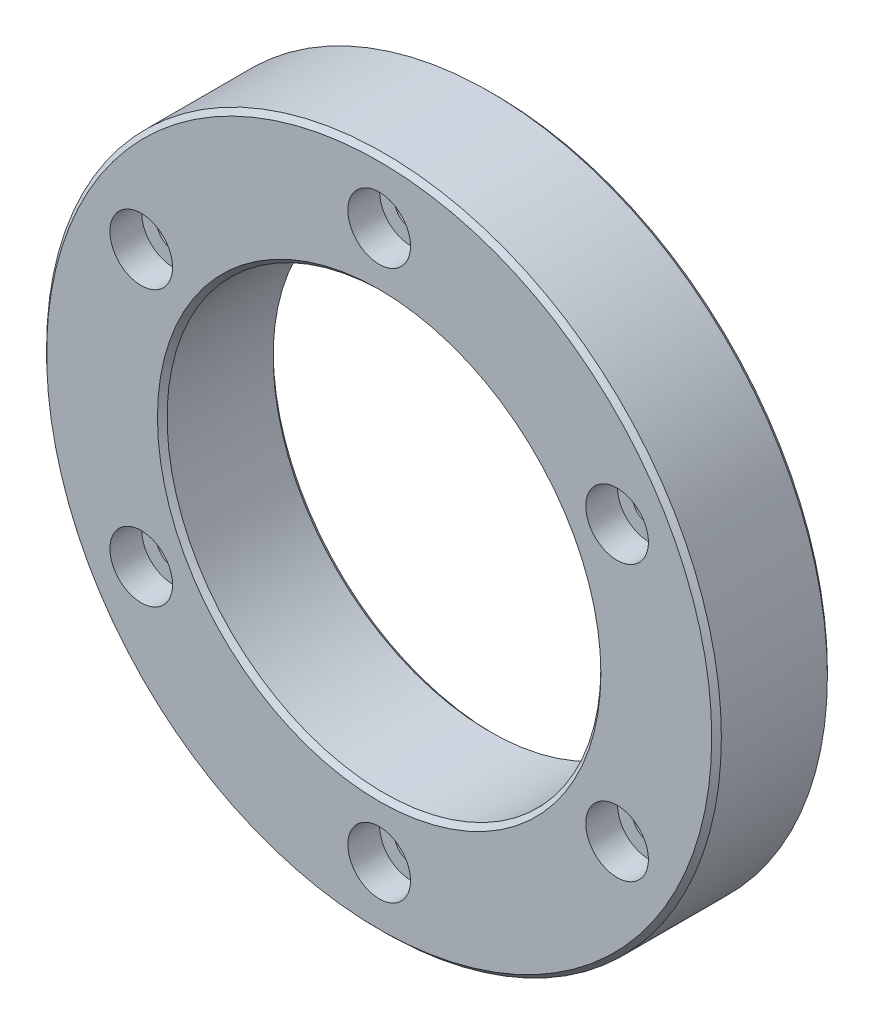
ISO-10303-21;
HEADER;
FILE_DESCRIPTION(('STEP AP214'),'2;1');
FILE_NAME('part.step','',(''),(''),'','','');
FILE_SCHEMA(('AUTOMOTIVE_DESIGN { 1 0 10303 214 1 1 1 1 }'));
ENDSEC;
DATA;
#1=APPLICATION_CONTEXT('core data for automotive mechanical design processes');
#2=APPLICATION_PROTOCOL_DEFINITION('international standard','automotive_design',2000,#1);
#3=PRODUCT_CONTEXT('',#1,'mechanical');
#4=PRODUCT('Part','Part','',(#3));
#5=PRODUCT_RELATED_PRODUCT_CATEGORY('part','',(#4));
#6=PRODUCT_DEFINITION_FORMATION('','',#4);
#7=PRODUCT_DEFINITION_CONTEXT('part definition',#1,'design');
#8=PRODUCT_DEFINITION('design','',#6,#7);
#9=PRODUCT_DEFINITION_SHAPE('','',#8);
#10=(LENGTH_UNIT() NAMED_UNIT(*) SI_UNIT(.MILLI.,.METRE.));
#11=(NAMED_UNIT(*) PLANE_ANGLE_UNIT() SI_UNIT($,.RADIAN.));
#12=(NAMED_UNIT(*) SI_UNIT($,.STERADIAN.) SOLID_ANGLE_UNIT());
#13=UNCERTAINTY_MEASURE_WITH_UNIT(LENGTH_MEASURE(1.E-05),#10,'distance_accuracy_value','');
#14=(GEOMETRIC_REPRESENTATION_CONTEXT(3) GLOBAL_UNCERTAINTY_ASSIGNED_CONTEXT((#13)) GLOBAL_UNIT_ASSIGNED_CONTEXT((#10,
#11,#12)) REPRESENTATION_CONTEXT('',''));
#15=CARTESIAN_POINT('',(0.,0.,0.));
#16=DIRECTION('',(0.,0.,1.));
#17=DIRECTION('',(1.,0.,0.));
#18=AXIS2_PLACEMENT_3D('',#15,#16,#17);
#19=CARTESIAN_POINT('',(0.,0.,6.));
#20=DIRECTION('',(0.,0.,1.));
#21=DIRECTION('',(1.,0.,0.));
#22=AXIS2_PLACEMENT_3D('',#19,#20,#21);
#23=PLANE('',#22);
#24=CARTESIAN_POINT('',(0.,0.,6.));
#25=DIRECTION('',(0.,0.,1.));
#26=DIRECTION('',(1.,0.,0.));
#27=AXIS2_PLACEMENT_3D('',#24,#25,#26);
#28=CIRCLE('',#27,34.5);
#29=CARTESIAN_POINT('',(34.5,0.,6.));
#30=VERTEX_POINT('',#29);
#31=EDGE_CURVE('E46',#30,#30,#28,.T.);
#32=ORIENTED_EDGE('',*,*,#31,.T.);
#33=EDGE_LOOP('',(#32));
#34=FACE_BOUND('',#33,.T.);
#35=CARTESIAN_POINT('',(0.,0.,6.));
#36=DIRECTION('',(0.,0.,1.));
#37=DIRECTION('',(1.,0.,0.));
#38=AXIS2_PLACEMENT_3D('',#35,#36,#37);
#39=CIRCLE('',#38,23.);
#40=CARTESIAN_POINT('',(23.,0.,6.));
#41=VERTEX_POINT('',#40);
#42=EDGE_CURVE('E50',#41,#41,#39,.F.);
#43=ORIENTED_EDGE('',*,*,#42,.T.);
#44=EDGE_LOOP('',(#43));
#45=FACE_BOUND('',#44,.T.);
#46=CARTESIAN_POINT('',(-24.6817240078563,14.2500000000003,6.));
#47=DIRECTION('',(0.,0.,1.));
#48=DIRECTION('',(1.,0.,0.));
#49=AXIS2_PLACEMENT_3D('',#46,#47,#48);
#50=CIRCLE('',#49,3.25);
#51=CARTESIAN_POINT('',(-21.4317240078563,14.2500000000003,6.));
#52=VERTEX_POINT('',#51);
#53=EDGE_CURVE('E136',#52,#52,#50,.T.);
#54=ORIENTED_EDGE('',*,*,#53,.F.);
#55=EDGE_LOOP('',(#54));
#56=FACE_BOUND('',#55,.T.);
#57=CARTESIAN_POINT('',(-24.6817240078566,-14.2499999999998,6.));
#58=DIRECTION('',(0.,0.,1.));
#59=DIRECTION('',(1.,0.,0.));
#60=AXIS2_PLACEMENT_3D('',#57,#58,#59);
#61=CIRCLE('',#60,3.25);
#62=CARTESIAN_POINT('',(-21.4317240078566,-14.2499999999998,6.));
#63=VERTEX_POINT('',#62);
#64=EDGE_CURVE('E124',#63,#63,#61,.T.);
#65=ORIENTED_EDGE('',*,*,#64,.F.);
#66=EDGE_LOOP('',(#65));
#67=FACE_BOUND('',#66,.T.);
#68=CARTESIAN_POINT('',(0.,-28.5,6.));
#69=DIRECTION('',(0.,0.,1.));
#70=DIRECTION('',(1.,0.,0.));
#71=AXIS2_PLACEMENT_3D('',#68,#69,#70);
#72=CIRCLE('',#71,3.25);
#73=CARTESIAN_POINT('',(3.25,-28.5,6.));
#74=VERTEX_POINT('',#73);
#75=EDGE_CURVE('E112',#74,#74,#72,.T.);
#76=ORIENTED_EDGE('',*,*,#75,.F.);
#77=EDGE_LOOP('',(#76));
#78=FACE_BOUND('',#77,.T.);
#79=CARTESIAN_POINT('',(24.6817240078564,-14.2500000000001,6.));
#80=DIRECTION('',(0.,0.,1.));
#81=DIRECTION('',(1.,0.,0.));
#82=AXIS2_PLACEMENT_3D('',#79,#80,#81);
#83=CIRCLE('',#82,3.25);
#84=CARTESIAN_POINT('',(27.9317240078564,-14.2500000000001,6.));
#85=VERTEX_POINT('',#84);
#86=EDGE_CURVE('E100',#85,#85,#83,.T.);
#87=ORIENTED_EDGE('',*,*,#86,.F.);
#88=EDGE_LOOP('',(#87));
#89=FACE_BOUND('',#88,.T.);
#90=CARTESIAN_POINT('',(24.6817240078565,14.2499999999999,6.));
#91=DIRECTION('',(0.,0.,1.));
#92=DIRECTION('',(1.,0.,0.));
#93=AXIS2_PLACEMENT_3D('',#90,#91,#92);
#94=CIRCLE('',#93,3.25);
#95=CARTESIAN_POINT('',(27.9317240078565,14.2499999999999,6.));
#96=VERTEX_POINT('',#95);
#97=EDGE_CURVE('E88',#96,#96,#94,.T.);
#98=ORIENTED_EDGE('',*,*,#97,.F.);
#99=EDGE_LOOP('',(#98));
#100=FACE_BOUND('',#99,.T.);
#101=CARTESIAN_POINT('',(0.,28.5,6.));
#102=DIRECTION('',(0.,0.,1.));
#103=DIRECTION('',(1.,0.,0.));
#104=AXIS2_PLACEMENT_3D('',#101,#102,#103);
#105=CIRCLE('',#104,3.25);
#106=CARTESIAN_POINT('',(3.25,28.5,6.));
#107=VERTEX_POINT('',#106);
#108=EDGE_CURVE('E76',#107,#107,#105,.T.);
#109=ORIENTED_EDGE('',*,*,#108,.F.);
#110=EDGE_LOOP('',(#109));
#111=FACE_BOUND('',#110,.T.);
#112=ADVANCED_FACE('F35',(#34,#45,#56,#67,#78,#89,#100,#111),#23,.T.);
#113=CARTESIAN_POINT('',(0.,0.,-6.));
#114=DIRECTION('',(0.,0.,1.));
#115=DIRECTION('',(1.,0.,0.));
#116=AXIS2_PLACEMENT_3D('',#113,#114,#115);
#117=PLANE('',#116);
#118=CARTESIAN_POINT('',(0.,0.,-6.));
#119=DIRECTION('',(0.,0.,1.));
#120=DIRECTION('',(1.,0.,0.));
#121=AXIS2_PLACEMENT_3D('',#118,#119,#120);
#122=CIRCLE('',#121,34.5);
#123=CARTESIAN_POINT('',(34.5,0.,-6.));
#124=VERTEX_POINT('',#123);
#125=EDGE_CURVE('E55',#124,#124,#122,.F.);
#126=ORIENTED_EDGE('',*,*,#125,.T.);
#127=EDGE_LOOP('',(#126));
#128=FACE_BOUND('',#127,.T.);
#129=CARTESIAN_POINT('',(0.,0.,-6.));
#130=DIRECTION('',(0.,0.,1.));
#131=DIRECTION('',(1.,0.,0.));
#132=AXIS2_PLACEMENT_3D('',#129,#130,#131);
#133=CIRCLE('',#132,23.);
#134=CARTESIAN_POINT('',(23.,0.,-6.));
#135=VERTEX_POINT('',#134);
#136=EDGE_CURVE('E58',#135,#135,#133,.T.);
#137=ORIENTED_EDGE('',*,*,#136,.T.);
#138=EDGE_LOOP('',(#137));
#139=FACE_BOUND('',#138,.T.);
#140=CARTESIAN_POINT('',(-24.6817240078563,14.2500000000003,-6.));
#141=DIRECTION('',(0.,0.,1.));
#142=DIRECTION('',(1.,0.,0.));
#143=AXIS2_PLACEMENT_3D('',#140,#141,#142);
#144=CIRCLE('',#143,1.7);
#145=CARTESIAN_POINT('',(-22.9817240078563,14.2500000000003,-6.));
#146=VERTEX_POINT('',#145);
#147=EDGE_CURVE('E127',#146,#146,#144,.T.);
#148=ORIENTED_EDGE('',*,*,#147,.T.);
#149=EDGE_LOOP('',(#148));
#150=FACE_BOUND('',#149,.T.);
#151=CARTESIAN_POINT('',(-24.6817240078566,-14.2499999999998,-6.));
#152=DIRECTION('',(0.,0.,1.));
#153=DIRECTION('',(1.,0.,0.));
#154=AXIS2_PLACEMENT_3D('',#151,#152,#153);
#155=CIRCLE('',#154,1.7);
#156=CARTESIAN_POINT('',(-22.9817240078566,-14.2499999999998,-6.));
#157=VERTEX_POINT('',#156);
#158=EDGE_CURVE('E115',#157,#157,#155,.T.);
#159=ORIENTED_EDGE('',*,*,#158,.T.);
#160=EDGE_LOOP('',(#159));
#161=FACE_BOUND('',#160,.T.);
#162=CARTESIAN_POINT('',(0.,-28.5,-6.));
#163=DIRECTION('',(0.,0.,1.));
#164=DIRECTION('',(1.,0.,0.));
#165=AXIS2_PLACEMENT_3D('',#162,#163,#164);
#166=CIRCLE('',#165,1.7);
#167=CARTESIAN_POINT('',(1.7,-28.5,-6.));
#168=VERTEX_POINT('',#167);
#169=EDGE_CURVE('E103',#168,#168,#166,.T.);
#170=ORIENTED_EDGE('',*,*,#169,.T.);
#171=EDGE_LOOP('',(#170));
#172=FACE_BOUND('',#171,.T.);
#173=CARTESIAN_POINT('',(24.6817240078564,-14.2500000000001,-6.));
#174=DIRECTION('',(0.,0.,1.));
#175=DIRECTION('',(1.,0.,0.));
#176=AXIS2_PLACEMENT_3D('',#173,#174,#175);
#177=CIRCLE('',#176,1.7);
#178=CARTESIAN_POINT('',(26.3817240078564,-14.2500000000001,-6.));
#179=VERTEX_POINT('',#178);
#180=EDGE_CURVE('E91',#179,#179,#177,.T.);
#181=ORIENTED_EDGE('',*,*,#180,.T.);
#182=EDGE_LOOP('',(#181));
#183=FACE_BOUND('',#182,.T.);
#184=CARTESIAN_POINT('',(24.6817240078565,14.2499999999999,-6.));
#185=DIRECTION('',(0.,0.,1.));
#186=DIRECTION('',(1.,0.,0.));
#187=AXIS2_PLACEMENT_3D('',#184,#185,#186);
#188=CIRCLE('',#187,1.7);
#189=CARTESIAN_POINT('',(26.3817240078565,14.2499999999999,-6.));
#190=VERTEX_POINT('',#189);
#191=EDGE_CURVE('E79',#190,#190,#188,.T.);
#192=ORIENTED_EDGE('',*,*,#191,.T.);
#193=EDGE_LOOP('',(#192));
#194=FACE_BOUND('',#193,.T.);
#195=CARTESIAN_POINT('',(0.,28.5,-6.));
#196=DIRECTION('',(0.,0.,1.));
#197=DIRECTION('',(1.,0.,0.));
#198=AXIS2_PLACEMENT_3D('',#195,#196,#197);
#199=CIRCLE('',#198,1.7);
#200=CARTESIAN_POINT('',(1.7,28.5,-6.));
#201=VERTEX_POINT('',#200);
#202=EDGE_CURVE('E67',#201,#201,#199,.T.);
#203=ORIENTED_EDGE('',*,*,#202,.T.);
#204=EDGE_LOOP('',(#203));
#205=FACE_BOUND('',#204,.T.);
#206=ADVANCED_FACE('F144',(#128,#139,#150,#161,#172,#183,#194,#205),#117,.F.);
#207=CARTESIAN_POINT('',(0.,0.,6.));
#208=DIRECTION('',(0.,0.,-1.));
#209=DIRECTION('',(-1.,0.,0.));
#210=AXIS2_PLACEMENT_3D('',#207,#208,#209);
#211=CYLINDRICAL_SURFACE('',#210,35.);
#212=CARTESIAN_POINT('',(0.,0.,-5.5));
#213=DIRECTION('',(0.,0.,1.));
#214=DIRECTION('',(1.,0.,0.));
#215=AXIS2_PLACEMENT_3D('',#212,#213,#214);
#216=CIRCLE('',#215,35.);
#217=CARTESIAN_POINT('',(35.,0.,-5.5));
#218=VERTEX_POINT('',#217);
#219=EDGE_CURVE('E61',#218,#218,#216,.T.);
#220=ORIENTED_EDGE('',*,*,#219,.T.);
#221=EDGE_LOOP('',(#220));
#222=FACE_BOUND('',#221,.T.);
#223=CARTESIAN_POINT('',(0.,0.,5.5));
#224=DIRECTION('',(0.,0.,1.));
#225=DIRECTION('',(1.,0.,0.));
#226=AXIS2_PLACEMENT_3D('',#223,#224,#225);
#227=CIRCLE('',#226,35.);
#228=CARTESIAN_POINT('',(35.,0.,5.5));
#229=VERTEX_POINT('',#228);
#230=EDGE_CURVE('E64',#229,#229,#227,.F.);
#231=ORIENTED_EDGE('',*,*,#230,.T.);
#232=EDGE_LOOP('',(#231));
#233=FACE_BOUND('',#232,.T.);
#234=ADVANCED_FACE('F181',(#222,#233),#211,.T.);
#235=CARTESIAN_POINT('',(0.,0.,6.));
#236=DIRECTION('',(0.,0.,-1.));
#237=DIRECTION('',(-1.,0.,0.));
#238=AXIS2_PLACEMENT_3D('',#235,#236,#237);
#239=CYLINDRICAL_SURFACE('',#238,22.5);
#240=CARTESIAN_POINT('',(0.,0.,-5.5));
#241=DIRECTION('',(0.,0.,1.));
#242=DIRECTION('',(1.,0.,0.));
#243=AXIS2_PLACEMENT_3D('',#240,#241,#242);
#244=CIRCLE('',#243,22.5);
#245=CARTESIAN_POINT('',(22.5,0.,-5.5));
#246=VERTEX_POINT('',#245);
#247=EDGE_CURVE('E10',#246,#246,#244,.F.);
#248=ORIENTED_EDGE('',*,*,#247,.T.);
#249=EDGE_LOOP('',(#248));
#250=FACE_BOUND('',#249,.T.);
#251=CARTESIAN_POINT('',(0.,0.,5.5));
#252=DIRECTION('',(0.,0.,1.));
#253=DIRECTION('',(1.,0.,0.));
#254=AXIS2_PLACEMENT_3D('',#251,#252,#253);
#255=CIRCLE('',#254,22.5);
#256=CARTESIAN_POINT('',(22.5,0.,5.5));
#257=VERTEX_POINT('',#256);
#258=EDGE_CURVE('E42',#257,#257,#255,.T.);
#259=ORIENTED_EDGE('',*,*,#258,.T.);
#260=EDGE_LOOP('',(#259));
#261=FACE_BOUND('',#260,.T.);
#262=ADVANCED_FACE('F178',(#250,#261),#239,.F.);
#263=CARTESIAN_POINT('',(0.,28.5,6.));
#264=DIRECTION('',(0.,0.,1.));
#265=DIRECTION('',(1.,0.,0.));
#266=AXIS2_PLACEMENT_3D('',#263,#264,#265);
#267=CYLINDRICAL_SURFACE('',#266,1.7);
#268=ORIENTED_EDGE('',*,*,#202,.F.);
#269=EDGE_LOOP('',(#268));
#270=FACE_BOUND('',#269,.T.);
#271=CARTESIAN_POINT('',(0.,28.5,2.7));
#272=DIRECTION('',(0.,0.,1.));
#273=DIRECTION('',(1.,0.,0.));
#274=AXIS2_PLACEMENT_3D('',#271,#272,#273);
#275=CIRCLE('',#274,1.7);
#276=CARTESIAN_POINT('',(1.7,28.5,2.7));
#277=VERTEX_POINT('',#276);
#278=EDGE_CURVE('E70',#277,#277,#275,.T.);
#279=ORIENTED_EDGE('',*,*,#278,.T.);
#280=EDGE_LOOP('',(#279));
#281=FACE_BOUND('',#280,.T.);
#282=ADVANCED_FACE('F170',(#270,#281),#267,.F.);
#283=CARTESIAN_POINT('',(1.7,28.5,2.7));
#284=DIRECTION('',(0.,0.,-1.));
#285=DIRECTION('',(-1.,0.,0.));
#286=AXIS2_PLACEMENT_3D('',#283,#284,#285);
#287=PLANE('',#286);
#288=ORIENTED_EDGE('',*,*,#278,.F.);
#289=EDGE_LOOP('',(#288));
#290=FACE_BOUND('',#289,.T.);
#291=CARTESIAN_POINT('',(0.,28.5,2.7));
#292=DIRECTION('',(0.,0.,1.));
#293=DIRECTION('',(1.,0.,0.));
#294=AXIS2_PLACEMENT_3D('',#291,#292,#293);
#295=CIRCLE('',#294,3.25);
#296=CARTESIAN_POINT('',(3.25,28.5,2.7));
#297=VERTEX_POINT('',#296);
#298=EDGE_CURVE('E73',#297,#297,#295,.T.);
#299=ORIENTED_EDGE('',*,*,#298,.T.);
#300=EDGE_LOOP('',(#299));
#301=FACE_BOUND('',#300,.T.);
#302=ADVANCED_FACE('F160',(#290,#301),#287,.F.);
#303=CARTESIAN_POINT('',(0.,28.5,6.));
#304=DIRECTION('',(0.,0.,1.));
#305=DIRECTION('',(1.,0.,0.));
#306=AXIS2_PLACEMENT_3D('',#303,#304,#305);
#307=CYLINDRICAL_SURFACE('',#306,3.25);
#308=ORIENTED_EDGE('',*,*,#298,.F.);
#309=EDGE_LOOP('',(#308));
#310=FACE_BOUND('',#309,.T.);
#311=ORIENTED_EDGE('',*,*,#108,.T.);
#312=EDGE_LOOP('',(#311));
#313=FACE_BOUND('',#312,.T.);
#314=ADVANCED_FACE('F157',(#310,#313),#307,.F.);
#315=CARTESIAN_POINT('',(24.6817240078565,14.2499999999999,6.));
#316=DIRECTION('',(0.,0.,1.));
#317=DIRECTION('',(1.,0.,0.));
#318=AXIS2_PLACEMENT_3D('',#315,#316,#317);
#319=CYLINDRICAL_SURFACE('',#318,1.7);
#320=ORIENTED_EDGE('',*,*,#191,.F.);
#321=EDGE_LOOP('',(#320));
#322=FACE_BOUND('',#321,.T.);
#323=CARTESIAN_POINT('',(24.6817240078565,14.2499999999999,2.7));
#324=DIRECTION('',(0.,0.,1.));
#325=DIRECTION('',(1.,0.,0.));
#326=AXIS2_PLACEMENT_3D('',#323,#324,#325);
#327=CIRCLE('',#326,1.7);
#328=CARTESIAN_POINT('',(26.3817240078565,14.2499999999999,2.7));
#329=VERTEX_POINT('',#328);
#330=EDGE_CURVE('E82',#329,#329,#327,.T.);
#331=ORIENTED_EDGE('',*,*,#330,.T.);
#332=EDGE_LOOP('',(#331));
#333=FACE_BOUND('',#332,.T.);
#334=ADVANCED_FACE('F159',(#322,#333),#319,.F.);
#335=CARTESIAN_POINT('',(26.3817240078565,14.2499999999999,2.7));
#336=DIRECTION('',(0.,0.,-1.));
#337=DIRECTION('',(-1.,0.,0.));
#338=AXIS2_PLACEMENT_3D('',#335,#336,#337);
#339=PLANE('',#338);
#340=ORIENTED_EDGE('',*,*,#330,.F.);
#341=EDGE_LOOP('',(#340));
#342=FACE_BOUND('',#341,.T.);
#343=CARTESIAN_POINT('',(24.6817240078565,14.2499999999999,2.7));
#344=DIRECTION('',(0.,0.,1.));
#345=DIRECTION('',(1.,0.,0.));
#346=AXIS2_PLACEMENT_3D('',#343,#344,#345);
#347=CIRCLE('',#346,3.25);
#348=CARTESIAN_POINT('',(27.9317240078565,14.2499999999999,2.7));
#349=VERTEX_POINT('',#348);
#350=EDGE_CURVE('E85',#349,#349,#347,.T.);
#351=ORIENTED_EDGE('',*,*,#350,.T.);
#352=EDGE_LOOP('',(#351));
#353=FACE_BOUND('',#352,.T.);
#354=ADVANCED_FACE('F167',(#342,#353),#339,.F.);
#355=CARTESIAN_POINT('',(24.6817240078565,14.2499999999999,6.));
#356=DIRECTION('',(0.,0.,1.));
#357=DIRECTION('',(1.,0.,0.));
#358=AXIS2_PLACEMENT_3D('',#355,#356,#357);
#359=CYLINDRICAL_SURFACE('',#358,3.25);
#360=ORIENTED_EDGE('',*,*,#350,.F.);
#361=EDGE_LOOP('',(#360));
#362=FACE_BOUND('',#361,.T.);
#363=ORIENTED_EDGE('',*,*,#97,.T.);
#364=EDGE_LOOP('',(#363));
#365=FACE_BOUND('',#364,.T.);
#366=ADVANCED_FACE('F226',(#362,#365),#359,.F.);
#367=CARTESIAN_POINT('',(24.6817240078564,-14.2500000000001,6.));
#368=DIRECTION('',(0.,0.,1.));
#369=DIRECTION('',(1.,0.,0.));
#370=AXIS2_PLACEMENT_3D('',#367,#368,#369);
#371=CYLINDRICAL_SURFACE('',#370,1.7);
#372=ORIENTED_EDGE('',*,*,#180,.F.);
#373=EDGE_LOOP('',(#372));
#374=FACE_BOUND('',#373,.T.);
#375=CARTESIAN_POINT('',(24.6817240078564,-14.2500000000001,2.7));
#376=DIRECTION('',(0.,0.,1.));
#377=DIRECTION('',(1.,0.,0.));
#378=AXIS2_PLACEMENT_3D('',#375,#376,#377);
#379=CIRCLE('',#378,1.7);
#380=CARTESIAN_POINT('',(26.3817240078564,-14.2500000000001,2.7));
#381=VERTEX_POINT('',#380);
#382=EDGE_CURVE('E94',#381,#381,#379,.T.);
#383=ORIENTED_EDGE('',*,*,#382,.T.);
#384=EDGE_LOOP('',(#383));
#385=FACE_BOUND('',#384,.T.);
#386=ADVANCED_FACE('F231',(#374,#385),#371,.F.);
#387=CARTESIAN_POINT('',(26.3817240078564,-14.2500000000001,2.7));
#388=DIRECTION('',(0.,0.,-1.));
#389=DIRECTION('',(-1.,0.,0.));
#390=AXIS2_PLACEMENT_3D('',#387,#388,#389);
#391=PLANE('',#390);
#392=ORIENTED_EDGE('',*,*,#382,.F.);
#393=EDGE_LOOP('',(#392));
#394=FACE_BOUND('',#393,.T.);
#395=CARTESIAN_POINT('',(24.6817240078564,-14.2500000000001,2.7));
#396=DIRECTION('',(0.,0.,1.));
#397=DIRECTION('',(1.,0.,0.));
#398=AXIS2_PLACEMENT_3D('',#395,#396,#397);
#399=CIRCLE('',#398,3.25);
#400=CARTESIAN_POINT('',(27.9317240078564,-14.2500000000001,2.7));
#401=VERTEX_POINT('',#400);
#402=EDGE_CURVE('E97',#401,#401,#399,.T.);
#403=ORIENTED_EDGE('',*,*,#402,.T.);
#404=EDGE_LOOP('',(#403));
#405=FACE_BOUND('',#404,.T.);
#406=ADVANCED_FACE('F236',(#394,#405),#391,.F.);
#407=CARTESIAN_POINT('',(24.6817240078564,-14.2500000000001,6.));
#408=DIRECTION('',(0.,0.,1.));
#409=DIRECTION('',(1.,0.,0.));
#410=AXIS2_PLACEMENT_3D('',#407,#408,#409);
#411=CYLINDRICAL_SURFACE('',#410,3.25);
#412=ORIENTED_EDGE('',*,*,#402,.F.);
#413=EDGE_LOOP('',(#412));
#414=FACE_BOUND('',#413,.T.);
#415=ORIENTED_EDGE('',*,*,#86,.T.);
#416=EDGE_LOOP('',(#415));
#417=FACE_BOUND('',#416,.T.);
#418=ADVANCED_FACE('F242',(#414,#417),#411,.F.);
#419=CARTESIAN_POINT('',(0.,-28.5,6.));
#420=DIRECTION('',(0.,0.,1.));
#421=DIRECTION('',(1.,0.,0.));
#422=AXIS2_PLACEMENT_3D('',#419,#420,#421);
#423=CYLINDRICAL_SURFACE('',#422,1.7);
#424=ORIENTED_EDGE('',*,*,#169,.F.);
#425=EDGE_LOOP('',(#424));
#426=FACE_BOUND('',#425,.T.);
#427=CARTESIAN_POINT('',(0.,-28.5,2.7));
#428=DIRECTION('',(0.,0.,1.));
#429=DIRECTION('',(1.,0.,0.));
#430=AXIS2_PLACEMENT_3D('',#427,#428,#429);
#431=CIRCLE('',#430,1.7);
#432=CARTESIAN_POINT('',(1.7,-28.5,2.7));
#433=VERTEX_POINT('',#432);
#434=EDGE_CURVE('E106',#433,#433,#431,.T.);
#435=ORIENTED_EDGE('',*,*,#434,.T.);
#436=EDGE_LOOP('',(#435));
#437=FACE_BOUND('',#436,.T.);
#438=ADVANCED_FACE('F246',(#426,#437),#423,.F.);
#439=CARTESIAN_POINT('',(1.7,-28.5,2.7));
#440=DIRECTION('',(0.,0.,-1.));
#441=DIRECTION('',(-1.,0.,0.));
#442=AXIS2_PLACEMENT_3D('',#439,#440,#441);
#443=PLANE('',#442);
#444=ORIENTED_EDGE('',*,*,#434,.F.);
#445=EDGE_LOOP('',(#444));
#446=FACE_BOUND('',#445,.T.);
#447=CARTESIAN_POINT('',(0.,-28.5,2.7));
#448=DIRECTION('',(0.,0.,1.));
#449=DIRECTION('',(1.,0.,0.));
#450=AXIS2_PLACEMENT_3D('',#447,#448,#449);
#451=CIRCLE('',#450,3.25);
#452=CARTESIAN_POINT('',(3.25,-28.5,2.7));
#453=VERTEX_POINT('',#452);
#454=EDGE_CURVE('E109',#453,#453,#451,.T.);
#455=ORIENTED_EDGE('',*,*,#454,.T.);
#456=EDGE_LOOP('',(#455));
#457=FACE_BOUND('',#456,.T.);
#458=ADVANCED_FACE('F250',(#446,#457),#443,.F.);
#459=CARTESIAN_POINT('',(0.,-28.5,6.));
#460=DIRECTION('',(0.,0.,1.));
#461=DIRECTION('',(1.,0.,0.));
#462=AXIS2_PLACEMENT_3D('',#459,#460,#461);
#463=CYLINDRICAL_SURFACE('',#462,3.25);
#464=ORIENTED_EDGE('',*,*,#454,.F.);
#465=EDGE_LOOP('',(#464));
#466=FACE_BOUND('',#465,.T.);
#467=ORIENTED_EDGE('',*,*,#75,.T.);
#468=EDGE_LOOP('',(#467));
#469=FACE_BOUND('',#468,.T.);
#470=ADVANCED_FACE('F254',(#466,#469),#463,.F.);
#471=CARTESIAN_POINT('',(-24.6817240078566,-14.2499999999998,6.));
#472=DIRECTION('',(0.,0.,1.));
#473=DIRECTION('',(1.,0.,0.));
#474=AXIS2_PLACEMENT_3D('',#471,#472,#473);
#475=CYLINDRICAL_SURFACE('',#474,1.7);
#476=ORIENTED_EDGE('',*,*,#158,.F.);
#477=EDGE_LOOP('',(#476));
#478=FACE_BOUND('',#477,.T.);
#479=CARTESIAN_POINT('',(-24.6817240078566,-14.2499999999998,2.7));
#480=DIRECTION('',(0.,0.,1.));
#481=DIRECTION('',(1.,0.,0.));
#482=AXIS2_PLACEMENT_3D('',#479,#480,#481);
#483=CIRCLE('',#482,1.7);
#484=CARTESIAN_POINT('',(-22.9817240078566,-14.2499999999998,2.7));
#485=VERTEX_POINT('',#484);
#486=EDGE_CURVE('E118',#485,#485,#483,.T.);
#487=ORIENTED_EDGE('',*,*,#486,.T.);
#488=EDGE_LOOP('',(#487));
#489=FACE_BOUND('',#488,.T.);
#490=ADVANCED_FACE('F258',(#478,#489),#475,.F.);
#491=CARTESIAN_POINT('',(-22.9817240078566,-14.2499999999998,2.7));
#492=DIRECTION('',(0.,0.,-1.));
#493=DIRECTION('',(-1.,0.,0.));
#494=AXIS2_PLACEMENT_3D('',#491,#492,#493);
#495=PLANE('',#494);
#496=ORIENTED_EDGE('',*,*,#486,.F.);
#497=EDGE_LOOP('',(#496));
#498=FACE_BOUND('',#497,.T.);
#499=CARTESIAN_POINT('',(-24.6817240078566,-14.2499999999998,2.7));
#500=DIRECTION('',(0.,0.,1.));
#501=DIRECTION('',(1.,0.,0.));
#502=AXIS2_PLACEMENT_3D('',#499,#500,#501);
#503=CIRCLE('',#502,3.25);
#504=CARTESIAN_POINT('',(-21.4317240078566,-14.2499999999998,2.7));
#505=VERTEX_POINT('',#504);
#506=EDGE_CURVE('E121',#505,#505,#503,.T.);
#507=ORIENTED_EDGE('',*,*,#506,.T.);
#508=EDGE_LOOP('',(#507));
#509=FACE_BOUND('',#508,.T.);
#510=ADVANCED_FACE('F262',(#498,#509),#495,.F.);
#511=CARTESIAN_POINT('',(-24.6817240078566,-14.2499999999998,6.));
#512=DIRECTION('',(0.,0.,1.));
#513=DIRECTION('',(1.,0.,0.));
#514=AXIS2_PLACEMENT_3D('',#511,#512,#513);
#515=CYLINDRICAL_SURFACE('',#514,3.25);
#516=ORIENTED_EDGE('',*,*,#506,.F.);
#517=EDGE_LOOP('',(#516));
#518=FACE_BOUND('',#517,.T.);
#519=ORIENTED_EDGE('',*,*,#64,.T.);
#520=EDGE_LOOP('',(#519));
#521=FACE_BOUND('',#520,.T.);
#522=ADVANCED_FACE('F266',(#518,#521),#515,.F.);
#523=CARTESIAN_POINT('',(-24.6817240078563,14.2500000000003,6.));
#524=DIRECTION('',(0.,0.,1.));
#525=DIRECTION('',(1.,0.,0.));
#526=AXIS2_PLACEMENT_3D('',#523,#524,#525);
#527=CYLINDRICAL_SURFACE('',#526,1.7);
#528=ORIENTED_EDGE('',*,*,#147,.F.);
#529=EDGE_LOOP('',(#528));
#530=FACE_BOUND('',#529,.T.);
#531=CARTESIAN_POINT('',(-24.6817240078563,14.2500000000003,2.7));
#532=DIRECTION('',(0.,0.,1.));
#533=DIRECTION('',(1.,0.,0.));
#534=AXIS2_PLACEMENT_3D('',#531,#532,#533);
#535=CIRCLE('',#534,1.7);
#536=CARTESIAN_POINT('',(-22.9817240078563,14.2500000000003,2.7));
#537=VERTEX_POINT('',#536);
#538=EDGE_CURVE('E130',#537,#537,#535,.T.);
#539=ORIENTED_EDGE('',*,*,#538,.T.);
#540=EDGE_LOOP('',(#539));
#541=FACE_BOUND('',#540,.T.);
#542=ADVANCED_FACE('F270',(#530,#541),#527,.F.);
#543=CARTESIAN_POINT('',(-22.9817240078563,14.2500000000003,2.7));
#544=DIRECTION('',(0.,0.,-1.));
#545=DIRECTION('',(-1.,0.,0.));
#546=AXIS2_PLACEMENT_3D('',#543,#544,#545);
#547=PLANE('',#546);
#548=ORIENTED_EDGE('',*,*,#538,.F.);
#549=EDGE_LOOP('',(#548));
#550=FACE_BOUND('',#549,.T.);
#551=CARTESIAN_POINT('',(-24.6817240078563,14.2500000000003,2.7));
#552=DIRECTION('',(0.,0.,1.));
#553=DIRECTION('',(1.,0.,0.));
#554=AXIS2_PLACEMENT_3D('',#551,#552,#553);
#555=CIRCLE('',#554,3.25);
#556=CARTESIAN_POINT('',(-21.4317240078563,14.2500000000003,2.7));
#557=VERTEX_POINT('',#556);
#558=EDGE_CURVE('E133',#557,#557,#555,.T.);
#559=ORIENTED_EDGE('',*,*,#558,.T.);
#560=EDGE_LOOP('',(#559));
#561=FACE_BOUND('',#560,.T.);
#562=ADVANCED_FACE('F274',(#550,#561),#547,.F.);
#563=CARTESIAN_POINT('',(-24.6817240078563,14.2500000000003,6.));
#564=DIRECTION('',(0.,0.,1.));
#565=DIRECTION('',(1.,0.,0.));
#566=AXIS2_PLACEMENT_3D('',#563,#564,#565);
#567=CYLINDRICAL_SURFACE('',#566,3.25);
#568=ORIENTED_EDGE('',*,*,#558,.F.);
#569=EDGE_LOOP('',(#568));
#570=FACE_BOUND('',#569,.T.);
#571=ORIENTED_EDGE('',*,*,#53,.T.);
#572=EDGE_LOOP('',(#571));
#573=FACE_BOUND('',#572,.T.);
#574=ADVANCED_FACE('F140',(#570,#573),#567,.F.);
#575=CARTESIAN_POINT('',(0.,0.,-5.5));
#576=DIRECTION('',(0.,0.,1.));
#577=DIRECTION('',(1.,0.,0.));
#578=AXIS2_PLACEMENT_3D('',#575,#576,#577);
#579=CONICAL_SURFACE('',#578,35.,0.785398163397448);
#580=ORIENTED_EDGE('',*,*,#125,.F.);
#581=EDGE_LOOP('',(#580));
#582=FACE_BOUND('',#581,.T.);
#583=ORIENTED_EDGE('',*,*,#219,.F.);
#584=EDGE_LOOP('',(#583));
#585=FACE_BOUND('',#584,.T.);
#586=ADVANCED_FACE('F189',(#582,#585),#579,.T.);
#587=CARTESIAN_POINT('',(0.,0.,6.));
#588=DIRECTION('',(0.,0.,-1.));
#589=DIRECTION('',(-1.,0.,0.));
#590=AXIS2_PLACEMENT_3D('',#587,#588,#589);
#591=CONICAL_SURFACE('',#590,34.5,0.785398163397448);
#592=ORIENTED_EDGE('',*,*,#230,.F.);
#593=EDGE_LOOP('',(#592));
#594=FACE_BOUND('',#593,.T.);
#595=ORIENTED_EDGE('',*,*,#31,.F.);
#596=EDGE_LOOP('',(#595));
#597=FACE_BOUND('',#596,.T.);
#598=ADVANCED_FACE('F192',(#594,#597),#591,.T.);
#599=CARTESIAN_POINT('',(0.,0.,-6.));
#600=DIRECTION('',(0.,0.,-1.));
#601=DIRECTION('',(-1.,0.,0.));
#602=AXIS2_PLACEMENT_3D('',#599,#600,#601);
#603=CONICAL_SURFACE('',#602,23.,0.785398163397441);
#604=ORIENTED_EDGE('',*,*,#247,.F.);
#605=EDGE_LOOP('',(#604));
#606=FACE_BOUND('',#605,.T.);
#607=ORIENTED_EDGE('',*,*,#136,.F.);
#608=EDGE_LOOP('',(#607));
#609=FACE_BOUND('',#608,.T.);
#610=ADVANCED_FACE('F195',(#606,#609),#603,.F.);
#611=CARTESIAN_POINT('',(0.,0.,5.5));
#612=DIRECTION('',(0.,0.,1.));
#613=DIRECTION('',(1.,0.,0.));
#614=AXIS2_PLACEMENT_3D('',#611,#612,#613);
#615=CONICAL_SURFACE('',#614,22.5,0.785398163397448);
#616=ORIENTED_EDGE('',*,*,#42,.F.);
#617=EDGE_LOOP('',(#616));
#618=FACE_BOUND('',#617,.T.);
#619=ORIENTED_EDGE('',*,*,#258,.F.);
#620=EDGE_LOOP('',(#619));
#621=FACE_BOUND('',#620,.T.);
#622=ADVANCED_FACE('F37',(#618,#621),#615,.F.);
#623=CLOSED_SHELL('',(#112,#206,#234,#262,#282,#302,#314,#334,#354,#366,#386,#406,#418,#438,
#458,#470,#490,#510,#522,#542,#562,#574,#586,#598,#610,#622));
#624=MANIFOLD_SOLID_BREP('B2',#623);
#625=ADVANCED_BREP_SHAPE_REPRESENTATION('',(#18,#624),#14);
#626=SHAPE_DEFINITION_REPRESENTATION(#9,#625);
ENDSEC;
END-ISO-10303-21;
